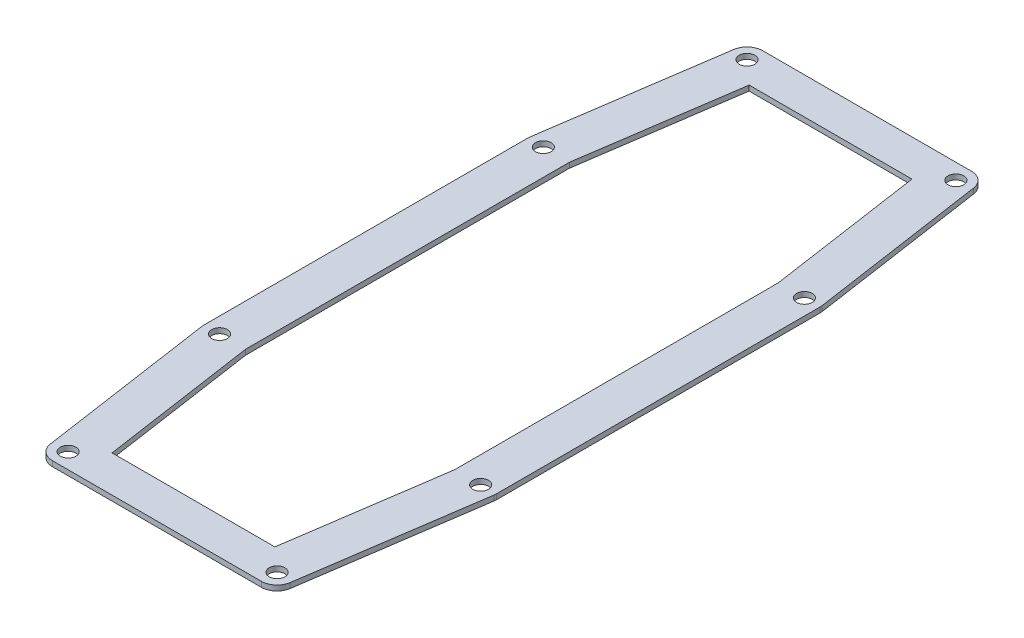
ISO-10303-21;
HEADER;
FILE_DESCRIPTION(('STEP AP214'),'2;1');
FILE_NAME('part.step','',(''),(''),'','','');
FILE_SCHEMA(('AUTOMOTIVE_DESIGN { 1 0 10303 214 1 1 1 1 }'));
ENDSEC;
DATA;
#1=APPLICATION_CONTEXT('core data for automotive mechanical design processes');
#2=APPLICATION_PROTOCOL_DEFINITION('international standard','automotive_design',2000,#1);
#3=PRODUCT_CONTEXT('',#1,'mechanical');
#4=PRODUCT('Part','Part','',(#3));
#5=PRODUCT_RELATED_PRODUCT_CATEGORY('part','',(#4));
#6=PRODUCT_DEFINITION_FORMATION('','',#4);
#7=PRODUCT_DEFINITION_CONTEXT('part definition',#1,'design');
#8=PRODUCT_DEFINITION('design','',#6,#7);
#9=PRODUCT_DEFINITION_SHAPE('','',#8);
#10=(LENGTH_UNIT() NAMED_UNIT(*) SI_UNIT(.MILLI.,.METRE.));
#11=(NAMED_UNIT(*) PLANE_ANGLE_UNIT() SI_UNIT($,.RADIAN.));
#12=(NAMED_UNIT(*) SI_UNIT($,.STERADIAN.) SOLID_ANGLE_UNIT());
#13=UNCERTAINTY_MEASURE_WITH_UNIT(LENGTH_MEASURE(1.E-05),#10,'distance_accuracy_value','');
#14=(GEOMETRIC_REPRESENTATION_CONTEXT(3) GLOBAL_UNCERTAINTY_ASSIGNED_CONTEXT((#13)) GLOBAL_UNIT_ASSIGNED_CONTEXT((#10,
#11,#12)) REPRESENTATION_CONTEXT('',''));
#15=CARTESIAN_POINT('',(0.,0.,0.));
#16=DIRECTION('',(0.,0.,1.));
#17=DIRECTION('',(1.,0.,0.));
#18=AXIS2_PLACEMENT_3D('',#15,#16,#17);
#19=CARTESIAN_POINT('',(45.,1.,34.));
#20=DIRECTION('',(0.,-1.,0.));
#21=DIRECTION('',(0.,0.,-1.));
#22=AXIS2_PLACEMENT_3D('',#19,#20,#21);
#23=PLANE('',#22);
#24=CARTESIAN_POINT('',(45.,1.,34.));
#25=DIRECTION('',(0.,1.,0.));
#26=DIRECTION('',(0.,0.,1.));
#27=AXIS2_PLACEMENT_3D('',#24,#25,#26);
#28=CIRCLE('',#27,1.5);
#29=CARTESIAN_POINT('',(45.,1.,35.5));
#30=VERTEX_POINT('',#29);
#31=EDGE_CURVE('E261',#30,#30,#28,.T.);
#32=ORIENTED_EDGE('',*,*,#31,.F.);
#33=EDGE_LOOP('',(#32));
#34=FACE_BOUND('',#33,.T.);
#35=CARTESIAN_POINT('',(5.00000000000002,1.,34.));
#36=DIRECTION('',(0.,1.,0.));
#37=DIRECTION('',(0.,0.,1.));
#38=AXIS2_PLACEMENT_3D('',#35,#36,#37);
#39=CIRCLE('',#38,1.5);
#40=CARTESIAN_POINT('',(5.00000000000002,1.,35.5));
#41=VERTEX_POINT('',#40);
#42=EDGE_CURVE('E267',#41,#41,#39,.T.);
#43=ORIENTED_EDGE('',*,*,#42,.F.);
#44=EDGE_LOOP('',(#43));
#45=FACE_BOUND('',#44,.T.);
#46=CARTESIAN_POINT('',(45.,1.,-96.));
#47=DIRECTION('',(0.,1.,0.));
#48=DIRECTION('',(0.,0.,1.));
#49=AXIS2_PLACEMENT_3D('',#46,#47,#48);
#50=CIRCLE('',#49,1.5);
#51=CARTESIAN_POINT('',(45.,1.,-94.5));
#52=VERTEX_POINT('',#51);
#53=EDGE_CURVE('E273',#52,#52,#50,.T.);
#54=ORIENTED_EDGE('',*,*,#53,.F.);
#55=EDGE_LOOP('',(#54));
#56=FACE_BOUND('',#55,.T.);
#57=CARTESIAN_POINT('',(5.,1.,-96.));
#58=DIRECTION('',(0.,1.,0.));
#59=DIRECTION('',(0.,0.,1.));
#60=AXIS2_PLACEMENT_3D('',#57,#58,#59);
#61=CIRCLE('',#60,1.5);
#62=CARTESIAN_POINT('',(5.,1.,-94.5));
#63=VERTEX_POINT('',#62);
#64=EDGE_CURVE('E279',#63,#63,#61,.T.);
#65=ORIENTED_EDGE('',*,*,#64,.F.);
#66=EDGE_LOOP('',(#65));
#67=FACE_BOUND('',#66,.T.);
#68=CARTESIAN_POINT('',(50.,1.,0.));
#69=DIRECTION('',(0.,1.,0.));
#70=DIRECTION('',(0.,0.,1.));
#71=AXIS2_PLACEMENT_3D('',#68,#69,#70);
#72=CIRCLE('',#71,1.5);
#73=CARTESIAN_POINT('',(50.,1.,1.5));
#74=VERTEX_POINT('',#73);
#75=EDGE_CURVE('E285',#74,#74,#72,.T.);
#76=ORIENTED_EDGE('',*,*,#75,.F.);
#77=EDGE_LOOP('',(#76));
#78=FACE_BOUND('',#77,.T.);
#79=CARTESIAN_POINT('',(0.,1.,0.));
#80=DIRECTION('',(0.,1.,0.));
#81=DIRECTION('',(0.,0.,1.));
#82=AXIS2_PLACEMENT_3D('',#79,#80,#81);
#83=CIRCLE('',#82,1.5);
#84=CARTESIAN_POINT('',(0.,1.,1.5));
#85=VERTEX_POINT('',#84);
#86=EDGE_CURVE('E291',#85,#85,#83,.T.);
#87=ORIENTED_EDGE('',*,*,#86,.F.);
#88=EDGE_LOOP('',(#87));
#89=FACE_BOUND('',#88,.T.);
#90=CARTESIAN_POINT('',(50.,1.,-62.));
#91=DIRECTION('',(0.,1.,0.));
#92=DIRECTION('',(0.,0.,1.));
#93=AXIS2_PLACEMENT_3D('',#90,#91,#92);
#94=CIRCLE('',#93,1.5);
#95=CARTESIAN_POINT('',(50.,1.,-60.5));
#96=VERTEX_POINT('',#95);
#97=EDGE_CURVE('E297',#96,#96,#94,.T.);
#98=ORIENTED_EDGE('',*,*,#97,.F.);
#99=EDGE_LOOP('',(#98));
#100=FACE_BOUND('',#99,.T.);
#101=CARTESIAN_POINT('',(0.,1.,-62.));
#102=DIRECTION('',(0.,1.,0.));
#103=DIRECTION('',(0.,0.,1.));
#104=AXIS2_PLACEMENT_3D('',#101,#102,#103);
#105=CIRCLE('',#104,1.5);
#106=CARTESIAN_POINT('',(0.,1.,-60.5));
#107=VERTEX_POINT('',#106);
#108=EDGE_CURVE('E303',#107,#107,#105,.T.);
#109=ORIENTED_EDGE('',*,*,#108,.F.);
#110=EDGE_LOOP('',(#109));
#111=FACE_BOUND('',#110,.T.);
#112=CARTESIAN_POINT('',(45.,1.,34.));
#113=DIRECTION('',(0.,1.,0.));
#114=DIRECTION('',(0.,0.,-1.));
#115=AXIS2_PLACEMENT_3D('',#112,#113,#114);
#116=CIRCLE('',#115,2.99999999999999);
#117=CARTESIAN_POINT('',(45.,1.,37.));
#118=VERTEX_POINT('',#117);
#119=CARTESIAN_POINT('',(47.9680774060946,1.,34.4364819714845));
#120=VERTEX_POINT('',#119);
#121=EDGE_CURVE('E309',#118,#120,#116,.T.);
#122=ORIENTED_EDGE('',*,*,#121,.T.);
#123=DIRECTION('',(0.145493990494832,0.,-0.989359135364853));
#124=VECTOR('',#123,1.);
#125=CARTESIAN_POINT('',(52.9680774060946,1.,0.436481971484495));
#126=LINE('',#125,#124);
#127=CARTESIAN_POINT('',(52.9680774060946,1.,0.436481971484495));
#128=VERTEX_POINT('',#127);
#129=EDGE_CURVE('E312',#120,#128,#126,.T.);
#130=ORIENTED_EDGE('',*,*,#129,.T.);
#131=CARTESIAN_POINT('',(50.,1.,0.));
#132=DIRECTION('',(0.,1.,0.));
#133=DIRECTION('',(0.,0.,-1.));
#134=AXIS2_PLACEMENT_3D('',#131,#132,#133);
#135=CIRCLE('',#134,3.);
#136=CARTESIAN_POINT('',(53.,1.,0.));
#137=VERTEX_POINT('',#136);
#138=EDGE_CURVE('E315',#128,#137,#135,.T.);
#139=ORIENTED_EDGE('',*,*,#138,.T.);
#140=DIRECTION('',(0.,0.,-1.));
#141=VECTOR('',#140,1.);
#142=CARTESIAN_POINT('',(53.,1.,-62.));
#143=LINE('',#142,#141);
#144=CARTESIAN_POINT('',(53.,1.,-62.));
#145=VERTEX_POINT('',#144);
#146=EDGE_CURVE('E317',#137,#145,#143,.T.);
#147=ORIENTED_EDGE('',*,*,#146,.T.);
#148=CARTESIAN_POINT('',(50.,1.,-62.));
#149=DIRECTION('',(0.,1.,0.));
#150=DIRECTION('',(0.,0.,-1.));
#151=AXIS2_PLACEMENT_3D('',#148,#149,#150);
#152=CIRCLE('',#151,2.99999999999999);
#153=CARTESIAN_POINT('',(52.9680774060946,1.,-62.4364819714845));
#154=VERTEX_POINT('',#153);
#155=EDGE_CURVE('E319',#145,#154,#152,.T.);
#156=ORIENTED_EDGE('',*,*,#155,.T.);
#157=DIRECTION('',(-0.145493990494831,0.,-0.989359135364853));
#158=VECTOR('',#157,1.);
#159=CARTESIAN_POINT('',(47.9680774060946,1.,-96.4364819714845));
#160=LINE('',#159,#158);
#161=CARTESIAN_POINT('',(47.9680774060946,1.,-96.4364819714845));
#162=VERTEX_POINT('',#161);
#163=EDGE_CURVE('E321',#154,#162,#160,.T.);
#164=ORIENTED_EDGE('',*,*,#163,.T.);
#165=CARTESIAN_POINT('',(45.,1.,-96.));
#166=DIRECTION('',(0.,1.,0.));
#167=DIRECTION('',(0.,0.,-1.));
#168=AXIS2_PLACEMENT_3D('',#165,#166,#167);
#169=CIRCLE('',#168,3.);
#170=CARTESIAN_POINT('',(45.,1.,-99.));
#171=VERTEX_POINT('',#170);
#172=EDGE_CURVE('E323',#162,#171,#169,.T.);
#173=ORIENTED_EDGE('',*,*,#172,.T.);
#174=DIRECTION('',(-1.,0.,0.));
#175=VECTOR('',#174,1.);
#176=CARTESIAN_POINT('',(5.,1.,-99.));
#177=LINE('',#176,#175);
#178=CARTESIAN_POINT('',(5.,1.,-99.));
#179=VERTEX_POINT('',#178);
#180=EDGE_CURVE('E325',#171,#179,#177,.T.);
#181=ORIENTED_EDGE('',*,*,#180,.T.);
#182=CARTESIAN_POINT('',(5.,1.,-96.));
#183=DIRECTION('',(0.,1.,0.));
#184=DIRECTION('',(0.,0.,1.));
#185=AXIS2_PLACEMENT_3D('',#182,#183,#184);
#186=CIRCLE('',#185,3.00000000000001);
#187=CARTESIAN_POINT('',(2.03192259390543,1.,-96.4364819714845));
#188=VERTEX_POINT('',#187);
#189=EDGE_CURVE('E327',#179,#188,#186,.T.);
#190=ORIENTED_EDGE('',*,*,#189,.T.);
#191=DIRECTION('',(-0.145493990494831,0.,0.989359135364853));
#192=VECTOR('',#191,1.);
#193=CARTESIAN_POINT('',(2.03192259390544,1.,-96.4364819714845));
#194=LINE('',#193,#192);
#195=CARTESIAN_POINT('',(-2.96807740609456,1.,-62.4364819714845));
#196=VERTEX_POINT('',#195);
#197=EDGE_CURVE('E329',#188,#196,#194,.T.);
#198=ORIENTED_EDGE('',*,*,#197,.T.);
#199=CARTESIAN_POINT('',(0.,1.,-62.));
#200=DIRECTION('',(0.,1.,0.));
#201=DIRECTION('',(0.,0.,1.));
#202=AXIS2_PLACEMENT_3D('',#199,#200,#201);
#203=CIRCLE('',#202,3.);
#204=CARTESIAN_POINT('',(-3.,1.,-62.));
#205=VERTEX_POINT('',#204);
#206=EDGE_CURVE('E331',#196,#205,#203,.T.);
#207=ORIENTED_EDGE('',*,*,#206,.T.);
#208=DIRECTION('',(0.,0.,1.));
#209=VECTOR('',#208,1.);
#210=CARTESIAN_POINT('',(-3.,1.,-62.));
#211=LINE('',#210,#209);
#212=CARTESIAN_POINT('',(-3.,1.,0.));
#213=VERTEX_POINT('',#212);
#214=EDGE_CURVE('E333',#205,#213,#211,.T.);
#215=ORIENTED_EDGE('',*,*,#214,.T.);
#216=CARTESIAN_POINT('',(0.,1.,0.));
#217=DIRECTION('',(0.,1.,0.));
#218=DIRECTION('',(0.,0.,1.));
#219=AXIS2_PLACEMENT_3D('',#216,#217,#218);
#220=CIRCLE('',#219,3.);
#221=CARTESIAN_POINT('',(-2.96807740609456,1.,0.436481971484493));
#222=VERTEX_POINT('',#221);
#223=EDGE_CURVE('E335',#213,#222,#220,.T.);
#224=ORIENTED_EDGE('',*,*,#223,.T.);
#225=DIRECTION('',(0.145493990494832,0.,0.989359135364853));
#226=VECTOR('',#225,1.);
#227=CARTESIAN_POINT('',(-2.96807740609456,1.,0.436481971484495));
#228=LINE('',#227,#226);
#229=CARTESIAN_POINT('',(2.03192259390546,1.,34.4364819714845));
#230=VERTEX_POINT('',#229);
#231=EDGE_CURVE('E337',#222,#230,#228,.T.);
#232=ORIENTED_EDGE('',*,*,#231,.T.);
#233=CARTESIAN_POINT('',(5.00000000000002,1.,34.));
#234=DIRECTION('',(0.,1.,0.));
#235=DIRECTION('',(0.,0.,1.));
#236=AXIS2_PLACEMENT_3D('',#233,#234,#235);
#237=CIRCLE('',#236,3.);
#238=CARTESIAN_POINT('',(5.00000000000002,1.,37.));
#239=VERTEX_POINT('',#238);
#240=EDGE_CURVE('E339',#230,#239,#237,.T.);
#241=ORIENTED_EDGE('',*,*,#240,.T.);
#242=DIRECTION('',(1.,0.,0.));
#243=VECTOR('',#242,1.);
#244=CARTESIAN_POINT('',(5.00000000000002,1.,37.));
#245=LINE('',#244,#243);
#246=EDGE_CURVE('E341',#239,#118,#245,.T.);
#247=ORIENTED_EDGE('',*,*,#246,.T.);
#248=EDGE_LOOP('',(#122,#130,#139,#147,#156,#164,#173,#181,#190,#198,#207,#215,#224,#232,#241,#247));
#249=FACE_BOUND('',#248,.T.);
#250=DIRECTION('',(-1.,0.,0.));
#251=VECTOR('',#250,1.);
#252=CARTESIAN_POINT('',(9.41176470588236,1.,-92.));
#253=LINE('',#252,#251);
#254=CARTESIAN_POINT('',(40.5882352941176,1.,-92.));
#255=VERTEX_POINT('',#254);
#256=CARTESIAN_POINT('',(9.41176470588236,1.,-92.));
#257=VERTEX_POINT('',#256);
#258=EDGE_CURVE('E196',#255,#257,#253,.T.);
#259=ORIENTED_EDGE('',*,*,#258,.F.);
#260=DIRECTION('',(-0.145493990494832,0.,-0.989359135364853));
#261=VECTOR('',#260,1.);
#262=CARTESIAN_POINT('',(40.5882352941176,1.,-92.));
#263=LINE('',#262,#261);
#264=CARTESIAN_POINT('',(45.,1.,-62.));
#265=VERTEX_POINT('',#264);
#266=EDGE_CURVE('E229',#265,#255,#263,.T.);
#267=ORIENTED_EDGE('',*,*,#266,.F.);
#268=DIRECTION('',(0.,0.,-1.));
#269=VECTOR('',#268,1.);
#270=CARTESIAN_POINT('',(45.,1.,-62.));
#271=LINE('',#270,#269);
#272=CARTESIAN_POINT('',(45.,1.,0.));
#273=VERTEX_POINT('',#272);
#274=EDGE_CURVE('E227',#273,#265,#271,.T.);
#275=ORIENTED_EDGE('',*,*,#274,.F.);
#276=DIRECTION('',(0.145493990494831,0.,-0.989359135364853));
#277=VECTOR('',#276,1.);
#278=CARTESIAN_POINT('',(45.,1.,0.));
#279=LINE('',#278,#277);
#280=CARTESIAN_POINT('',(40.5882352941176,1.,30.));
#281=VERTEX_POINT('',#280);
#282=EDGE_CURVE('E225',#281,#273,#279,.T.);
#283=ORIENTED_EDGE('',*,*,#282,.F.);
#284=DIRECTION('',(1.,0.,0.));
#285=VECTOR('',#284,1.);
#286=CARTESIAN_POINT('',(9.41176470588238,1.,30.));
#287=LINE('',#286,#285);
#288=CARTESIAN_POINT('',(9.41176470588238,1.,30.));
#289=VERTEX_POINT('',#288);
#290=EDGE_CURVE('E223',#289,#281,#287,.T.);
#291=ORIENTED_EDGE('',*,*,#290,.F.);
#292=DIRECTION('',(0.145493990494832,0.,0.989359135364853));
#293=VECTOR('',#292,1.);
#294=CARTESIAN_POINT('',(5.00000000000002,1.,0.));
#295=LINE('',#294,#293);
#296=CARTESIAN_POINT('',(5.00000000000002,1.,0.));
#297=VERTEX_POINT('',#296);
#298=EDGE_CURVE('E219',#297,#289,#295,.T.);
#299=ORIENTED_EDGE('',*,*,#298,.F.);
#300=DIRECTION('',(0.,0.,1.));
#301=VECTOR('',#300,1.);
#302=CARTESIAN_POINT('',(5.,1.,-62.));
#303=LINE('',#302,#301);
#304=CARTESIAN_POINT('',(5.,1.,-62.));
#305=VERTEX_POINT('',#304);
#306=EDGE_CURVE('E217',#305,#297,#303,.T.);
#307=ORIENTED_EDGE('',*,*,#306,.F.);
#308=DIRECTION('',(-0.145493990494831,0.,0.989359135364853));
#309=VECTOR('',#308,1.);
#310=CARTESIAN_POINT('',(9.41176470588236,1.,-92.));
#311=LINE('',#310,#309);
#312=EDGE_CURVE('E204',#257,#305,#311,.T.);
#313=ORIENTED_EDGE('',*,*,#312,.F.);
#314=EDGE_LOOP('',(#259,#267,#275,#283,#291,#299,#307,#313));
#315=FACE_BOUND('',#314,.T.);
#316=ADVANCED_FACE('F35',(#34,#45,#56,#67,#78,#89,#100,#111,#249,#315),#23,.F.);
#317=CARTESIAN_POINT('',(45.,0.,34.));
#318=DIRECTION('',(0.,-1.,0.));
#319=DIRECTION('',(0.,0.,-1.));
#320=AXIS2_PLACEMENT_3D('',#317,#318,#319);
#321=PLANE('',#320);
#322=CARTESIAN_POINT('',(5.00000000000002,0.,34.));
#323=DIRECTION('',(0.,1.,0.));
#324=DIRECTION('',(0.,0.,1.));
#325=AXIS2_PLACEMENT_3D('',#322,#323,#324);
#326=CIRCLE('',#325,1.5);
#327=CARTESIAN_POINT('',(5.00000000000002,0.,35.5));
#328=VERTEX_POINT('',#327);
#329=EDGE_CURVE('E264',#328,#328,#326,.T.);
#330=ORIENTED_EDGE('',*,*,#329,.T.);
#331=EDGE_LOOP('',(#330));
#332=FACE_BOUND('',#331,.T.);
#333=CARTESIAN_POINT('',(5.,0.,-96.));
#334=DIRECTION('',(0.,1.,0.));
#335=DIRECTION('',(0.,0.,1.));
#336=AXIS2_PLACEMENT_3D('',#333,#334,#335);
#337=CIRCLE('',#336,1.5);
#338=CARTESIAN_POINT('',(5.,0.,-94.5));
#339=VERTEX_POINT('',#338);
#340=EDGE_CURVE('E276',#339,#339,#337,.T.);
#341=ORIENTED_EDGE('',*,*,#340,.T.);
#342=EDGE_LOOP('',(#341));
#343=FACE_BOUND('',#342,.T.);
#344=CARTESIAN_POINT('',(0.,0.,0.));
#345=DIRECTION('',(0.,1.,0.));
#346=DIRECTION('',(0.,0.,1.));
#347=AXIS2_PLACEMENT_3D('',#344,#345,#346);
#348=CIRCLE('',#347,1.5);
#349=CARTESIAN_POINT('',(0.,0.,1.5));
#350=VERTEX_POINT('',#349);
#351=EDGE_CURVE('E288',#350,#350,#348,.T.);
#352=ORIENTED_EDGE('',*,*,#351,.T.);
#353=EDGE_LOOP('',(#352));
#354=FACE_BOUND('',#353,.T.);
#355=CARTESIAN_POINT('',(0.,0.,-62.));
#356=DIRECTION('',(0.,1.,0.));
#357=DIRECTION('',(0.,0.,1.));
#358=AXIS2_PLACEMENT_3D('',#355,#356,#357);
#359=CIRCLE('',#358,1.5);
#360=CARTESIAN_POINT('',(0.,0.,-60.5));
#361=VERTEX_POINT('',#360);
#362=EDGE_CURVE('E300',#361,#361,#359,.T.);
#363=ORIENTED_EDGE('',*,*,#362,.T.);
#364=EDGE_LOOP('',(#363));
#365=FACE_BOUND('',#364,.T.);
#366=CARTESIAN_POINT('',(45.,0.,34.));
#367=DIRECTION('',(0.,1.,0.));
#368=DIRECTION('',(0.,0.,-1.));
#369=AXIS2_PLACEMENT_3D('',#366,#367,#368);
#370=CIRCLE('',#369,2.99999999999999);
#371=CARTESIAN_POINT('',(45.,0.,37.));
#372=VERTEX_POINT('',#371);
#373=CARTESIAN_POINT('',(47.9680774060946,0.,34.4364819714845));
#374=VERTEX_POINT('',#373);
#375=EDGE_CURVE('E306',#372,#374,#370,.T.);
#376=ORIENTED_EDGE('',*,*,#375,.F.);
#377=DIRECTION('',(1.,0.,0.));
#378=VECTOR('',#377,1.);
#379=CARTESIAN_POINT('',(5.00000000000002,0.,37.));
#380=LINE('',#379,#378);
#381=CARTESIAN_POINT('',(5.00000000000002,0.,37.));
#382=VERTEX_POINT('',#381);
#383=EDGE_CURVE('E313',#382,#372,#380,.T.);
#384=ORIENTED_EDGE('',*,*,#383,.F.);
#385=CARTESIAN_POINT('',(5.00000000000002,0.,34.));
#386=DIRECTION('',(0.,1.,0.));
#387=DIRECTION('',(0.,0.,1.));
#388=AXIS2_PLACEMENT_3D('',#385,#386,#387);
#389=CIRCLE('',#388,3.);
#390=CARTESIAN_POINT('',(2.03192259390546,0.,34.4364819714845));
#391=VERTEX_POINT('',#390);
#392=EDGE_CURVE('E372',#391,#382,#389,.T.);
#393=ORIENTED_EDGE('',*,*,#392,.F.);
#394=DIRECTION('',(0.145493990494832,0.,0.989359135364853));
#395=VECTOR('',#394,1.);
#396=CARTESIAN_POINT('',(-2.96807740609456,0.,0.436481971484495));
#397=LINE('',#396,#395);
#398=CARTESIAN_POINT('',(-2.96807740609456,0.,0.436481971484493));
#399=VERTEX_POINT('',#398);
#400=EDGE_CURVE('E370',#399,#391,#397,.T.);
#401=ORIENTED_EDGE('',*,*,#400,.F.);
#402=CARTESIAN_POINT('',(0.,0.,0.));
#403=DIRECTION('',(0.,1.,0.));
#404=DIRECTION('',(0.,0.,1.));
#405=AXIS2_PLACEMENT_3D('',#402,#403,#404);
#406=CIRCLE('',#405,3.);
#407=CARTESIAN_POINT('',(-3.,0.,0.));
#408=VERTEX_POINT('',#407);
#409=EDGE_CURVE('E368',#408,#399,#406,.T.);
#410=ORIENTED_EDGE('',*,*,#409,.F.);
#411=DIRECTION('',(0.,0.,1.));
#412=VECTOR('',#411,1.);
#413=CARTESIAN_POINT('',(-3.,0.,-62.));
#414=LINE('',#413,#412);
#415=CARTESIAN_POINT('',(-3.,0.,-62.));
#416=VERTEX_POINT('',#415);
#417=EDGE_CURVE('E366',#416,#408,#414,.T.);
#418=ORIENTED_EDGE('',*,*,#417,.F.);
#419=CARTESIAN_POINT('',(0.,0.,-62.));
#420=DIRECTION('',(0.,1.,0.));
#421=DIRECTION('',(0.,0.,1.));
#422=AXIS2_PLACEMENT_3D('',#419,#420,#421);
#423=CIRCLE('',#422,3.);
#424=CARTESIAN_POINT('',(-2.96807740609456,0.,-62.4364819714845));
#425=VERTEX_POINT('',#424);
#426=EDGE_CURVE('E364',#425,#416,#423,.T.);
#427=ORIENTED_EDGE('',*,*,#426,.F.);
#428=DIRECTION('',(-0.145493990494831,0.,0.989359135364853));
#429=VECTOR('',#428,1.);
#430=CARTESIAN_POINT('',(2.03192259390544,0.,-96.4364819714845));
#431=LINE('',#430,#429);
#432=CARTESIAN_POINT('',(2.03192259390543,0.,-96.4364819714845));
#433=VERTEX_POINT('',#432);
#434=EDGE_CURVE('E362',#433,#425,#431,.T.);
#435=ORIENTED_EDGE('',*,*,#434,.F.);
#436=CARTESIAN_POINT('',(5.,0.,-96.));
#437=DIRECTION('',(0.,1.,0.));
#438=DIRECTION('',(0.,0.,1.));
#439=AXIS2_PLACEMENT_3D('',#436,#437,#438);
#440=CIRCLE('',#439,3.00000000000001);
#441=CARTESIAN_POINT('',(5.,0.,-99.));
#442=VERTEX_POINT('',#441);
#443=EDGE_CURVE('E360',#442,#433,#440,.T.);
#444=ORIENTED_EDGE('',*,*,#443,.F.);
#445=DIRECTION('',(-1.,0.,0.));
#446=VECTOR('',#445,1.);
#447=CARTESIAN_POINT('',(5.,0.,-99.));
#448=LINE('',#447,#446);
#449=CARTESIAN_POINT('',(45.,0.,-99.));
#450=VERTEX_POINT('',#449);
#451=EDGE_CURVE('E358',#450,#442,#448,.T.);
#452=ORIENTED_EDGE('',*,*,#451,.F.);
#453=CARTESIAN_POINT('',(45.,0.,-96.));
#454=DIRECTION('',(0.,1.,0.));
#455=DIRECTION('',(0.,0.,-1.));
#456=AXIS2_PLACEMENT_3D('',#453,#454,#455);
#457=CIRCLE('',#456,3.);
#458=CARTESIAN_POINT('',(47.9680774060946,0.,-96.4364819714845));
#459=VERTEX_POINT('',#458);
#460=EDGE_CURVE('E356',#459,#450,#457,.T.);
#461=ORIENTED_EDGE('',*,*,#460,.F.);
#462=DIRECTION('',(-0.145493990494831,0.,-0.989359135364853));
#463=VECTOR('',#462,1.);
#464=CARTESIAN_POINT('',(47.9680774060946,0.,-96.4364819714845));
#465=LINE('',#464,#463);
#466=CARTESIAN_POINT('',(52.9680774060946,0.,-62.4364819714845));
#467=VERTEX_POINT('',#466);
#468=EDGE_CURVE('E354',#467,#459,#465,.T.);
#469=ORIENTED_EDGE('',*,*,#468,.F.);
#470=CARTESIAN_POINT('',(50.,0.,-62.));
#471=DIRECTION('',(0.,1.,0.));
#472=DIRECTION('',(0.,0.,-1.));
#473=AXIS2_PLACEMENT_3D('',#470,#471,#472);
#474=CIRCLE('',#473,2.99999999999999);
#475=CARTESIAN_POINT('',(53.,0.,-62.));
#476=VERTEX_POINT('',#475);
#477=EDGE_CURVE('E352',#476,#467,#474,.T.);
#478=ORIENTED_EDGE('',*,*,#477,.F.);
#479=DIRECTION('',(0.,0.,-1.));
#480=VECTOR('',#479,1.);
#481=CARTESIAN_POINT('',(53.,0.,-62.));
#482=LINE('',#481,#480);
#483=CARTESIAN_POINT('',(53.,0.,0.));
#484=VERTEX_POINT('',#483);
#485=EDGE_CURVE('E350',#484,#476,#482,.T.);
#486=ORIENTED_EDGE('',*,*,#485,.F.);
#487=CARTESIAN_POINT('',(50.,0.,0.));
#488=DIRECTION('',(0.,1.,0.));
#489=DIRECTION('',(0.,0.,-1.));
#490=AXIS2_PLACEMENT_3D('',#487,#488,#489);
#491=CIRCLE('',#490,3.);
#492=CARTESIAN_POINT('',(52.9680774060946,0.,0.436481971484495));
#493=VERTEX_POINT('',#492);
#494=EDGE_CURVE('E348',#493,#484,#491,.T.);
#495=ORIENTED_EDGE('',*,*,#494,.F.);
#496=DIRECTION('',(0.145493990494832,0.,-0.989359135364853));
#497=VECTOR('',#496,1.);
#498=CARTESIAN_POINT('',(52.9680774060946,0.,0.436481971484495));
#499=LINE('',#498,#497);
#500=EDGE_CURVE('E346',#374,#493,#499,.T.);
#501=ORIENTED_EDGE('',*,*,#500,.F.);
#502=EDGE_LOOP('',(#376,#384,#393,#401,#410,#418,#427,#435,#444,#452,#461,#469,#478,#486,#495,#501));
#503=FACE_BOUND('',#502,.T.);
#504=CARTESIAN_POINT('',(50.,0.,-62.));
#505=DIRECTION('',(0.,1.,0.));
#506=DIRECTION('',(0.,0.,1.));
#507=AXIS2_PLACEMENT_3D('',#504,#505,#506);
#508=CIRCLE('',#507,1.5);
#509=CARTESIAN_POINT('',(50.,0.,-60.5));
#510=VERTEX_POINT('',#509);
#511=EDGE_CURVE('E294',#510,#510,#508,.T.);
#512=ORIENTED_EDGE('',*,*,#511,.T.);
#513=EDGE_LOOP('',(#512));
#514=FACE_BOUND('',#513,.T.);
#515=CARTESIAN_POINT('',(50.,0.,0.));
#516=DIRECTION('',(0.,1.,0.));
#517=DIRECTION('',(0.,0.,1.));
#518=AXIS2_PLACEMENT_3D('',#515,#516,#517);
#519=CIRCLE('',#518,1.5);
#520=CARTESIAN_POINT('',(50.,0.,1.5));
#521=VERTEX_POINT('',#520);
#522=EDGE_CURVE('E282',#521,#521,#519,.T.);
#523=ORIENTED_EDGE('',*,*,#522,.T.);
#524=EDGE_LOOP('',(#523));
#525=FACE_BOUND('',#524,.T.);
#526=CARTESIAN_POINT('',(45.,0.,-96.));
#527=DIRECTION('',(0.,1.,0.));
#528=DIRECTION('',(0.,0.,1.));
#529=AXIS2_PLACEMENT_3D('',#526,#527,#528);
#530=CIRCLE('',#529,1.5);
#531=CARTESIAN_POINT('',(45.,0.,-94.5));
#532=VERTEX_POINT('',#531);
#533=EDGE_CURVE('E270',#532,#532,#530,.T.);
#534=ORIENTED_EDGE('',*,*,#533,.T.);
#535=EDGE_LOOP('',(#534));
#536=FACE_BOUND('',#535,.T.);
#537=CARTESIAN_POINT('',(45.,0.,34.));
#538=DIRECTION('',(0.,1.,0.));
#539=DIRECTION('',(0.,0.,1.));
#540=AXIS2_PLACEMENT_3D('',#537,#538,#539);
#541=CIRCLE('',#540,1.5);
#542=CARTESIAN_POINT('',(45.,0.,35.5));
#543=VERTEX_POINT('',#542);
#544=EDGE_CURVE('E212',#543,#543,#541,.T.);
#545=ORIENTED_EDGE('',*,*,#544,.T.);
#546=EDGE_LOOP('',(#545));
#547=FACE_BOUND('',#546,.T.);
#548=DIRECTION('',(-0.145493990494832,0.,-0.989359135364853));
#549=VECTOR('',#548,1.);
#550=CARTESIAN_POINT('',(40.5882352941176,0.,-92.));
#551=LINE('',#550,#549);
#552=CARTESIAN_POINT('',(45.,0.,-62.));
#553=VERTEX_POINT('',#552);
#554=CARTESIAN_POINT('',(40.5882352941176,0.,-92.));
#555=VERTEX_POINT('',#554);
#556=EDGE_CURVE('E205',#553,#555,#551,.T.);
#557=ORIENTED_EDGE('',*,*,#556,.T.);
#558=DIRECTION('',(-1.,0.,0.));
#559=VECTOR('',#558,1.);
#560=CARTESIAN_POINT('',(9.41176470588236,0.,-92.));
#561=LINE('',#560,#559);
#562=CARTESIAN_POINT('',(9.41176470588236,0.,-92.));
#563=VERTEX_POINT('',#562);
#564=EDGE_CURVE('E58',#555,#563,#561,.T.);
#565=ORIENTED_EDGE('',*,*,#564,.T.);
#566=DIRECTION('',(-0.145493990494831,0.,0.989359135364853));
#567=VECTOR('',#566,1.);
#568=CARTESIAN_POINT('',(9.41176470588236,0.,-92.));
#569=LINE('',#568,#567);
#570=CARTESIAN_POINT('',(5.,0.,-62.));
#571=VERTEX_POINT('',#570);
#572=EDGE_CURVE('E211',#563,#571,#569,.T.);
#573=ORIENTED_EDGE('',*,*,#572,.T.);
#574=DIRECTION('',(0.,0.,1.));
#575=VECTOR('',#574,1.);
#576=CARTESIAN_POINT('',(5.,0.,-62.));
#577=LINE('',#576,#575);
#578=CARTESIAN_POINT('',(5.00000000000002,0.,0.));
#579=VERTEX_POINT('',#578);
#580=EDGE_CURVE('E233',#571,#579,#577,.T.);
#581=ORIENTED_EDGE('',*,*,#580,.T.);
#582=DIRECTION('',(0.145493990494832,0.,0.989359135364853));
#583=VECTOR('',#582,1.);
#584=CARTESIAN_POINT('',(5.00000000000002,0.,0.));
#585=LINE('',#584,#583);
#586=CARTESIAN_POINT('',(9.41176470588238,0.,30.));
#587=VERTEX_POINT('',#586);
#588=EDGE_CURVE('E236',#579,#587,#585,.T.);
#589=ORIENTED_EDGE('',*,*,#588,.T.);
#590=DIRECTION('',(1.,0.,0.));
#591=VECTOR('',#590,1.);
#592=CARTESIAN_POINT('',(9.41176470588238,0.,30.));
#593=LINE('',#592,#591);
#594=CARTESIAN_POINT('',(40.5882352941176,0.,30.));
#595=VERTEX_POINT('',#594);
#596=EDGE_CURVE('E239',#587,#595,#593,.T.);
#597=ORIENTED_EDGE('',*,*,#596,.T.);
#598=DIRECTION('',(0.145493990494831,0.,-0.989359135364853));
#599=VECTOR('',#598,1.);
#600=CARTESIAN_POINT('',(45.,0.,0.));
#601=LINE('',#600,#599);
#602=CARTESIAN_POINT('',(45.,0.,0.));
#603=VERTEX_POINT('',#602);
#604=EDGE_CURVE('E242',#595,#603,#601,.T.);
#605=ORIENTED_EDGE('',*,*,#604,.T.);
#606=DIRECTION('',(0.,0.,-1.));
#607=VECTOR('',#606,1.);
#608=CARTESIAN_POINT('',(45.,0.,-62.));
#609=LINE('',#608,#607);
#610=EDGE_CURVE('E245',#603,#553,#609,.T.);
#611=ORIENTED_EDGE('',*,*,#610,.T.);
#612=EDGE_LOOP('',(#557,#565,#573,#581,#589,#597,#605,#611));
#613=FACE_BOUND('',#612,.T.);
#614=ADVANCED_FACE('F426',(#332,#343,#354,#365,#503,#514,#525,#536,#547,#613),#321,.T.);
#615=CARTESIAN_POINT('',(45.,1.,34.));
#616=DIRECTION('',(0.,-1.,0.));
#617=DIRECTION('',(0.,0.,-1.));
#618=AXIS2_PLACEMENT_3D('',#615,#616,#617);
#619=CYLINDRICAL_SURFACE('',#618,2.99999999999999);
#620=ORIENTED_EDGE('',*,*,#375,.T.);
#621=DIRECTION('',(0.,-1.,0.));
#622=VECTOR('',#621,1.);
#623=CARTESIAN_POINT('',(47.9680774060946,1.,34.4364819714845));
#624=LINE('',#623,#622);
#625=EDGE_CURVE('E11',#120,#374,#624,.T.);
#626=ORIENTED_EDGE('',*,*,#625,.F.);
#627=ORIENTED_EDGE('',*,*,#121,.F.);
#628=DIRECTION('',(0.,-1.,0.));
#629=VECTOR('',#628,1.);
#630=CARTESIAN_POINT('',(45.,1.,37.));
#631=LINE('',#630,#629);
#632=EDGE_CURVE('E343',#118,#372,#631,.T.);
#633=ORIENTED_EDGE('',*,*,#632,.T.);
#634=EDGE_LOOP('',(#620,#626,#627,#633));
#635=FACE_BOUND('',#634,.T.);
#636=ADVANCED_FACE('F37',(#635),#619,.T.);
#637=CARTESIAN_POINT('',(52.9680774060946,1.,0.436481971484495));
#638=DIRECTION('',(-0.989359135364853,0.,-0.145493990494832));
#639=DIRECTION('',(-0.145493990494832,0.,0.989359135364853));
#640=AXIS2_PLACEMENT_3D('',#637,#638,#639);
#641=PLANE('',#640);
#642=ORIENTED_EDGE('',*,*,#500,.T.);
#643=DIRECTION('',(0.,-1.,0.));
#644=VECTOR('',#643,1.);
#645=CARTESIAN_POINT('',(52.9680774060946,1.,0.436481971484495));
#646=LINE('',#645,#644);
#647=EDGE_CURVE('E43',#128,#493,#646,.T.);
#648=ORIENTED_EDGE('',*,*,#647,.F.);
#649=ORIENTED_EDGE('',*,*,#129,.F.);
#650=ORIENTED_EDGE('',*,*,#625,.T.);
#651=EDGE_LOOP('',(#642,#648,#649,#650));
#652=FACE_BOUND('',#651,.T.);
#653=ADVANCED_FACE('F443',(#652),#641,.F.);
#654=CARTESIAN_POINT('',(50.,1.,0.));
#655=DIRECTION('',(0.,-1.,0.));
#656=DIRECTION('',(0.,0.,-1.));
#657=AXIS2_PLACEMENT_3D('',#654,#655,#656);
#658=CYLINDRICAL_SURFACE('',#657,3.);
#659=ORIENTED_EDGE('',*,*,#494,.T.);
#660=DIRECTION('',(0.,-1.,0.));
#661=VECTOR('',#660,1.);
#662=CARTESIAN_POINT('',(53.,1.,0.));
#663=LINE('',#662,#661);
#664=EDGE_CURVE('E413',#137,#484,#663,.T.);
#665=ORIENTED_EDGE('',*,*,#664,.F.);
#666=ORIENTED_EDGE('',*,*,#138,.F.);
#667=ORIENTED_EDGE('',*,*,#647,.T.);
#668=EDGE_LOOP('',(#659,#665,#666,#667));
#669=FACE_BOUND('',#668,.T.);
#670=ADVANCED_FACE('F420',(#669),#658,.T.);
#671=CARTESIAN_POINT('',(53.,1.,-62.));
#672=DIRECTION('',(-1.,0.,0.));
#673=DIRECTION('',(0.,0.,1.));
#674=AXIS2_PLACEMENT_3D('',#671,#672,#673);
#675=PLANE('',#674);
#676=ORIENTED_EDGE('',*,*,#485,.T.);
#677=DIRECTION('',(0.,-1.,0.));
#678=VECTOR('',#677,1.);
#679=CARTESIAN_POINT('',(53.,1.,-62.));
#680=LINE('',#679,#678);
#681=EDGE_CURVE('E410',#145,#476,#680,.T.);
#682=ORIENTED_EDGE('',*,*,#681,.F.);
#683=ORIENTED_EDGE('',*,*,#146,.F.);
#684=ORIENTED_EDGE('',*,*,#664,.T.);
#685=EDGE_LOOP('',(#676,#682,#683,#684));
#686=FACE_BOUND('',#685,.T.);
#687=ADVANCED_FACE('F432',(#686),#675,.F.);
#688=CARTESIAN_POINT('',(50.,1.,-62.));
#689=DIRECTION('',(0.,-1.,0.));
#690=DIRECTION('',(0.,0.,-1.));
#691=AXIS2_PLACEMENT_3D('',#688,#689,#690);
#692=CYLINDRICAL_SURFACE('',#691,2.99999999999999);
#693=ORIENTED_EDGE('',*,*,#477,.T.);
#694=DIRECTION('',(0.,-1.,0.));
#695=VECTOR('',#694,1.);
#696=CARTESIAN_POINT('',(52.9680774060946,1.,-62.4364819714845));
#697=LINE('',#696,#695);
#698=EDGE_CURVE('E407',#154,#467,#697,.T.);
#699=ORIENTED_EDGE('',*,*,#698,.F.);
#700=ORIENTED_EDGE('',*,*,#155,.F.);
#701=ORIENTED_EDGE('',*,*,#681,.T.);
#702=EDGE_LOOP('',(#693,#699,#700,#701));
#703=FACE_BOUND('',#702,.T.);
#704=ADVANCED_FACE('F436',(#703),#692,.T.);
#705=CARTESIAN_POINT('',(47.9680774060946,1.,-96.4364819714845));
#706=DIRECTION('',(-0.989359135364853,0.,0.145493990494831));
#707=DIRECTION('',(0.145493990494831,0.,0.989359135364853));
#708=AXIS2_PLACEMENT_3D('',#705,#706,#707);
#709=PLANE('',#708);
#710=ORIENTED_EDGE('',*,*,#468,.T.);
#711=DIRECTION('',(0.,-1.,0.));
#712=VECTOR('',#711,1.);
#713=CARTESIAN_POINT('',(47.9680774060946,1.,-96.4364819714845));
#714=LINE('',#713,#712);
#715=EDGE_CURVE('E404',#162,#459,#714,.T.);
#716=ORIENTED_EDGE('',*,*,#715,.F.);
#717=ORIENTED_EDGE('',*,*,#163,.F.);
#718=ORIENTED_EDGE('',*,*,#698,.T.);
#719=EDGE_LOOP('',(#710,#716,#717,#718));
#720=FACE_BOUND('',#719,.T.);
#721=ADVANCED_FACE('F496',(#720),#709,.F.);
#722=CARTESIAN_POINT('',(45.,1.,-96.));
#723=DIRECTION('',(0.,-1.,0.));
#724=DIRECTION('',(0.,0.,-1.));
#725=AXIS2_PLACEMENT_3D('',#722,#723,#724);
#726=CYLINDRICAL_SURFACE('',#725,3.);
#727=ORIENTED_EDGE('',*,*,#460,.T.);
#728=DIRECTION('',(0.,-1.,0.));
#729=VECTOR('',#728,1.);
#730=CARTESIAN_POINT('',(45.,1.,-99.));
#731=LINE('',#730,#729);
#732=EDGE_CURVE('E401',#171,#450,#731,.T.);
#733=ORIENTED_EDGE('',*,*,#732,.F.);
#734=ORIENTED_EDGE('',*,*,#172,.F.);
#735=ORIENTED_EDGE('',*,*,#715,.T.);
#736=EDGE_LOOP('',(#727,#733,#734,#735));
#737=FACE_BOUND('',#736,.T.);
#738=ADVANCED_FACE('F493',(#737),#726,.T.);
#739=CARTESIAN_POINT('',(5.,1.,-99.));
#740=DIRECTION('',(0.,0.,1.));
#741=DIRECTION('',(1.,0.,0.));
#742=AXIS2_PLACEMENT_3D('',#739,#740,#741);
#743=PLANE('',#742);
#744=ORIENTED_EDGE('',*,*,#451,.T.);
#745=DIRECTION('',(0.,-1.,0.));
#746=VECTOR('',#745,1.);
#747=CARTESIAN_POINT('',(5.,1.,-99.));
#748=LINE('',#747,#746);
#749=EDGE_CURVE('E398',#179,#442,#748,.T.);
#750=ORIENTED_EDGE('',*,*,#749,.F.);
#751=ORIENTED_EDGE('',*,*,#180,.F.);
#752=ORIENTED_EDGE('',*,*,#732,.T.);
#753=EDGE_LOOP('',(#744,#750,#751,#752));
#754=FACE_BOUND('',#753,.T.);
#755=ADVANCED_FACE('F489',(#754),#743,.F.);
#756=CARTESIAN_POINT('',(5.,1.,-96.));
#757=DIRECTION('',(0.,-1.,0.));
#758=DIRECTION('',(0.,0.,-1.));
#759=AXIS2_PLACEMENT_3D('',#756,#757,#758);
#760=CYLINDRICAL_SURFACE('',#759,3.00000000000001);
#761=ORIENTED_EDGE('',*,*,#443,.T.);
#762=DIRECTION('',(0.,-1.,0.));
#763=VECTOR('',#762,1.);
#764=CARTESIAN_POINT('',(2.03192259390543,1.,-96.4364819714845));
#765=LINE('',#764,#763);
#766=EDGE_CURVE('E395',#188,#433,#765,.T.);
#767=ORIENTED_EDGE('',*,*,#766,.F.);
#768=ORIENTED_EDGE('',*,*,#189,.F.);
#769=ORIENTED_EDGE('',*,*,#749,.T.);
#770=EDGE_LOOP('',(#761,#767,#768,#769));
#771=FACE_BOUND('',#770,.T.);
#772=ADVANCED_FACE('F485',(#771),#760,.T.);
#773=CARTESIAN_POINT('',(2.03192259390544,1.,-96.4364819714845));
#774=DIRECTION('',(0.989359135364853,0.,0.145493990494831));
#775=DIRECTION('',(0.145493990494831,0.,-0.989359135364853));
#776=AXIS2_PLACEMENT_3D('',#773,#774,#775);
#777=PLANE('',#776);
#778=ORIENTED_EDGE('',*,*,#434,.T.);
#779=DIRECTION('',(0.,-1.,0.));
#780=VECTOR('',#779,1.);
#781=CARTESIAN_POINT('',(-2.96807740609456,1.,-62.4364819714845));
#782=LINE('',#781,#780);
#783=EDGE_CURVE('E392',#196,#425,#782,.T.);
#784=ORIENTED_EDGE('',*,*,#783,.F.);
#785=ORIENTED_EDGE('',*,*,#197,.F.);
#786=ORIENTED_EDGE('',*,*,#766,.T.);
#787=EDGE_LOOP('',(#778,#784,#785,#786));
#788=FACE_BOUND('',#787,.T.);
#789=ADVANCED_FACE('F480',(#788),#777,.F.);
#790=CARTESIAN_POINT('',(0.,1.,-62.));
#791=DIRECTION('',(0.,-1.,0.));
#792=DIRECTION('',(0.,0.,-1.));
#793=AXIS2_PLACEMENT_3D('',#790,#791,#792);
#794=CYLINDRICAL_SURFACE('',#793,3.);
#795=ORIENTED_EDGE('',*,*,#426,.T.);
#796=DIRECTION('',(0.,-1.,0.));
#797=VECTOR('',#796,1.);
#798=CARTESIAN_POINT('',(-3.,1.,-62.));
#799=LINE('',#798,#797);
#800=EDGE_CURVE('E389',#205,#416,#799,.T.);
#801=ORIENTED_EDGE('',*,*,#800,.F.);
#802=ORIENTED_EDGE('',*,*,#206,.F.);
#803=ORIENTED_EDGE('',*,*,#783,.T.);
#804=EDGE_LOOP('',(#795,#801,#802,#803));
#805=FACE_BOUND('',#804,.T.);
#806=ADVANCED_FACE('F474',(#805),#794,.T.);
#807=CARTESIAN_POINT('',(-3.,1.,-62.));
#808=DIRECTION('',(1.,0.,0.));
#809=DIRECTION('',(0.,0.,-1.));
#810=AXIS2_PLACEMENT_3D('',#807,#808,#809);
#811=PLANE('',#810);
#812=ORIENTED_EDGE('',*,*,#417,.T.);
#813=DIRECTION('',(0.,-1.,0.));
#814=VECTOR('',#813,1.);
#815=CARTESIAN_POINT('',(-3.,1.,0.));
#816=LINE('',#815,#814);
#817=EDGE_CURVE('E386',#213,#408,#816,.T.);
#818=ORIENTED_EDGE('',*,*,#817,.F.);
#819=ORIENTED_EDGE('',*,*,#214,.F.);
#820=ORIENTED_EDGE('',*,*,#800,.T.);
#821=EDGE_LOOP('',(#812,#818,#819,#820));
#822=FACE_BOUND('',#821,.T.);
#823=ADVANCED_FACE('F470',(#822),#811,.F.);
#824=CARTESIAN_POINT('',(0.,1.,0.));
#825=DIRECTION('',(0.,-1.,0.));
#826=DIRECTION('',(0.,0.,-1.));
#827=AXIS2_PLACEMENT_3D('',#824,#825,#826);
#828=CYLINDRICAL_SURFACE('',#827,3.);
#829=ORIENTED_EDGE('',*,*,#409,.T.);
#830=DIRECTION('',(0.,-1.,0.));
#831=VECTOR('',#830,1.);
#832=CARTESIAN_POINT('',(-2.96807740609456,1.,0.436481971484493));
#833=LINE('',#832,#831);
#834=EDGE_CURVE('E383',#222,#399,#833,.T.);
#835=ORIENTED_EDGE('',*,*,#834,.F.);
#836=ORIENTED_EDGE('',*,*,#223,.F.);
#837=ORIENTED_EDGE('',*,*,#817,.T.);
#838=EDGE_LOOP('',(#829,#835,#836,#837));
#839=FACE_BOUND('',#838,.T.);
#840=ADVANCED_FACE('F465',(#839),#828,.T.);
#841=CARTESIAN_POINT('',(-2.96807740609456,1.,0.436481971484495));
#842=DIRECTION('',(0.989359135364853,0.,-0.145493990494832));
#843=DIRECTION('',(-0.145493990494832,0.,-0.989359135364853));
#844=AXIS2_PLACEMENT_3D('',#841,#842,#843);
#845=PLANE('',#844);
#846=ORIENTED_EDGE('',*,*,#400,.T.);
#847=DIRECTION('',(0.,-1.,0.));
#848=VECTOR('',#847,1.);
#849=CARTESIAN_POINT('',(2.03192259390546,1.,34.4364819714845));
#850=LINE('',#849,#848);
#851=EDGE_CURVE('E380',#230,#391,#850,.T.);
#852=ORIENTED_EDGE('',*,*,#851,.F.);
#853=ORIENTED_EDGE('',*,*,#231,.F.);
#854=ORIENTED_EDGE('',*,*,#834,.T.);
#855=EDGE_LOOP('',(#846,#852,#853,#854));
#856=FACE_BOUND('',#855,.T.);
#857=ADVANCED_FACE('F459',(#856),#845,.F.);
#858=CARTESIAN_POINT('',(5.00000000000002,1.,34.));
#859=DIRECTION('',(0.,-1.,0.));
#860=DIRECTION('',(0.,0.,-1.));
#861=AXIS2_PLACEMENT_3D('',#858,#859,#860);
#862=CYLINDRICAL_SURFACE('',#861,3.);
#863=ORIENTED_EDGE('',*,*,#392,.T.);
#864=DIRECTION('',(0.,-1.,0.));
#865=VECTOR('',#864,1.);
#866=CARTESIAN_POINT('',(5.00000000000002,1.,37.));
#867=LINE('',#866,#865);
#868=EDGE_CURVE('E377',#239,#382,#867,.T.);
#869=ORIENTED_EDGE('',*,*,#868,.F.);
#870=ORIENTED_EDGE('',*,*,#240,.F.);
#871=ORIENTED_EDGE('',*,*,#851,.T.);
#872=EDGE_LOOP('',(#863,#869,#870,#871));
#873=FACE_BOUND('',#872,.T.);
#874=ADVANCED_FACE('F455',(#873),#862,.T.);
#875=CARTESIAN_POINT('',(5.00000000000002,1.,37.));
#876=DIRECTION('',(0.,0.,-1.));
#877=DIRECTION('',(-1.,0.,0.));
#878=AXIS2_PLACEMENT_3D('',#875,#876,#877);
#879=PLANE('',#878);
#880=ORIENTED_EDGE('',*,*,#383,.T.);
#881=ORIENTED_EDGE('',*,*,#632,.F.);
#882=ORIENTED_EDGE('',*,*,#246,.F.);
#883=ORIENTED_EDGE('',*,*,#868,.T.);
#884=EDGE_LOOP('',(#880,#881,#882,#883));
#885=FACE_BOUND('',#884,.T.);
#886=ADVANCED_FACE('F450',(#885),#879,.F.);
#887=CARTESIAN_POINT('',(0.,1.,-62.));
#888=DIRECTION('',(0.,-1.,0.));
#889=DIRECTION('',(0.,0.,-1.));
#890=AXIS2_PLACEMENT_3D('',#887,#888,#889);
#891=CYLINDRICAL_SURFACE('',#890,1.5);
#892=ORIENTED_EDGE('',*,*,#108,.T.);
#893=EDGE_LOOP('',(#892));
#894=FACE_BOUND('',#893,.T.);
#895=ORIENTED_EDGE('',*,*,#362,.F.);
#896=EDGE_LOOP('',(#895));
#897=FACE_BOUND('',#896,.T.);
#898=ADVANCED_FACE('F516',(#894,#897),#891,.F.);
#899=CARTESIAN_POINT('',(50.,1.,-62.));
#900=DIRECTION('',(0.,-1.,0.));
#901=DIRECTION('',(0.,0.,-1.));
#902=AXIS2_PLACEMENT_3D('',#899,#900,#901);
#903=CYLINDRICAL_SURFACE('',#902,1.5);
#904=ORIENTED_EDGE('',*,*,#97,.T.);
#905=EDGE_LOOP('',(#904));
#906=FACE_BOUND('',#905,.T.);
#907=ORIENTED_EDGE('',*,*,#511,.F.);
#908=EDGE_LOOP('',(#907));
#909=FACE_BOUND('',#908,.T.);
#910=ADVANCED_FACE('F578',(#906,#909),#903,.F.);
#911=CARTESIAN_POINT('',(0.,1.,0.));
#912=DIRECTION('',(0.,-1.,0.));
#913=DIRECTION('',(0.,0.,-1.));
#914=AXIS2_PLACEMENT_3D('',#911,#912,#913);
#915=CYLINDRICAL_SURFACE('',#914,1.5);
#916=ORIENTED_EDGE('',*,*,#86,.T.);
#917=EDGE_LOOP('',(#916));
#918=FACE_BOUND('',#917,.T.);
#919=ORIENTED_EDGE('',*,*,#351,.F.);
#920=EDGE_LOOP('',(#919));
#921=FACE_BOUND('',#920,.T.);
#922=ADVANCED_FACE('F585',(#918,#921),#915,.F.);
#923=CARTESIAN_POINT('',(50.,1.,0.));
#924=DIRECTION('',(0.,-1.,0.));
#925=DIRECTION('',(0.,0.,-1.));
#926=AXIS2_PLACEMENT_3D('',#923,#924,#925);
#927=CYLINDRICAL_SURFACE('',#926,1.5);
#928=ORIENTED_EDGE('',*,*,#75,.T.);
#929=EDGE_LOOP('',(#928));
#930=FACE_BOUND('',#929,.T.);
#931=ORIENTED_EDGE('',*,*,#522,.F.);
#932=EDGE_LOOP('',(#931));
#933=FACE_BOUND('',#932,.T.);
#934=ADVANCED_FACE('F592',(#930,#933),#927,.F.);
#935=CARTESIAN_POINT('',(5.,1.,-96.));
#936=DIRECTION('',(0.,-1.,0.));
#937=DIRECTION('',(0.,0.,-1.));
#938=AXIS2_PLACEMENT_3D('',#935,#936,#937);
#939=CYLINDRICAL_SURFACE('',#938,1.5);
#940=ORIENTED_EDGE('',*,*,#64,.T.);
#941=EDGE_LOOP('',(#940));
#942=FACE_BOUND('',#941,.T.);
#943=ORIENTED_EDGE('',*,*,#340,.F.);
#944=EDGE_LOOP('',(#943));
#945=FACE_BOUND('',#944,.T.);
#946=ADVANCED_FACE('F600',(#942,#945),#939,.F.);
#947=CARTESIAN_POINT('',(45.,1.,-96.));
#948=DIRECTION('',(0.,-1.,0.));
#949=DIRECTION('',(0.,0.,-1.));
#950=AXIS2_PLACEMENT_3D('',#947,#948,#949);
#951=CYLINDRICAL_SURFACE('',#950,1.5);
#952=ORIENTED_EDGE('',*,*,#53,.T.);
#953=EDGE_LOOP('',(#952));
#954=FACE_BOUND('',#953,.T.);
#955=ORIENTED_EDGE('',*,*,#533,.F.);
#956=EDGE_LOOP('',(#955));
#957=FACE_BOUND('',#956,.T.);
#958=ADVANCED_FACE('F608',(#954,#957),#951,.F.);
#959=CARTESIAN_POINT('',(5.00000000000002,1.,34.));
#960=DIRECTION('',(0.,-1.,0.));
#961=DIRECTION('',(0.,0.,-1.));
#962=AXIS2_PLACEMENT_3D('',#959,#960,#961);
#963=CYLINDRICAL_SURFACE('',#962,1.5);
#964=ORIENTED_EDGE('',*,*,#42,.T.);
#965=EDGE_LOOP('',(#964));
#966=FACE_BOUND('',#965,.T.);
#967=ORIENTED_EDGE('',*,*,#329,.F.);
#968=EDGE_LOOP('',(#967));
#969=FACE_BOUND('',#968,.T.);
#970=ADVANCED_FACE('F616',(#966,#969),#963,.F.);
#971=CARTESIAN_POINT('',(45.,1.,34.));
#972=DIRECTION('',(0.,-1.,0.));
#973=DIRECTION('',(0.,0.,-1.));
#974=AXIS2_PLACEMENT_3D('',#971,#972,#973);
#975=CYLINDRICAL_SURFACE('',#974,1.5);
#976=ORIENTED_EDGE('',*,*,#31,.T.);
#977=EDGE_LOOP('',(#976));
#978=FACE_BOUND('',#977,.T.);
#979=ORIENTED_EDGE('',*,*,#544,.F.);
#980=EDGE_LOOP('',(#979));
#981=FACE_BOUND('',#980,.T.);
#982=ADVANCED_FACE('F624',(#978,#981),#975,.F.);
#983=CARTESIAN_POINT('',(9.41176470588236,1.,-92.));
#984=DIRECTION('',(0.,0.,1.));
#985=DIRECTION('',(1.,0.,0.));
#986=AXIS2_PLACEMENT_3D('',#983,#984,#985);
#987=PLANE('',#986);
#988=ORIENTED_EDGE('',*,*,#564,.F.);
#989=DIRECTION('',(0.,-1.,0.));
#990=VECTOR('',#989,1.);
#991=CARTESIAN_POINT('',(40.5882352941176,1.,-92.));
#992=LINE('',#991,#990);
#993=EDGE_CURVE('E200',#255,#555,#992,.T.);
#994=ORIENTED_EDGE('',*,*,#993,.F.);
#995=ORIENTED_EDGE('',*,*,#258,.T.);
#996=DIRECTION('',(0.,-1.,0.));
#997=VECTOR('',#996,1.);
#998=CARTESIAN_POINT('',(9.41176470588236,1.,-92.));
#999=LINE('',#998,#997);
#1000=EDGE_CURVE('E199',#257,#563,#999,.T.);
#1001=ORIENTED_EDGE('',*,*,#1000,.T.);
#1002=EDGE_LOOP('',(#988,#994,#995,#1001));
#1003=FACE_BOUND('',#1002,.T.);
#1004=ADVANCED_FACE('F198',(#1003),#987,.T.);
#1005=CARTESIAN_POINT('',(9.41176470588236,1.,-92.));
#1006=DIRECTION('',(0.989359135364853,0.,0.145493990494831));
#1007=DIRECTION('',(0.145493990494831,0.,-0.989359135364853));
#1008=AXIS2_PLACEMENT_3D('',#1005,#1006,#1007);
#1009=PLANE('',#1008);
#1010=ORIENTED_EDGE('',*,*,#572,.F.);
#1011=ORIENTED_EDGE('',*,*,#1000,.F.);
#1012=ORIENTED_EDGE('',*,*,#312,.T.);
#1013=DIRECTION('',(0.,-1.,0.));
#1014=VECTOR('',#1013,1.);
#1015=CARTESIAN_POINT('',(5.,1.,-62.));
#1016=LINE('',#1015,#1014);
#1017=EDGE_CURVE('E213',#305,#571,#1016,.T.);
#1018=ORIENTED_EDGE('',*,*,#1017,.T.);
#1019=EDGE_LOOP('',(#1010,#1011,#1012,#1018));
#1020=FACE_BOUND('',#1019,.T.);
#1021=ADVANCED_FACE('F208',(#1020),#1009,.T.);
#1022=CARTESIAN_POINT('',(5.,1.,-62.));
#1023=DIRECTION('',(1.,0.,0.));
#1024=DIRECTION('',(0.,0.,-1.));
#1025=AXIS2_PLACEMENT_3D('',#1022,#1023,#1024);
#1026=PLANE('',#1025);
#1027=ORIENTED_EDGE('',*,*,#580,.F.);
#1028=ORIENTED_EDGE('',*,*,#1017,.F.);
#1029=ORIENTED_EDGE('',*,*,#306,.T.);
#1030=DIRECTION('',(0.,-1.,0.));
#1031=VECTOR('',#1030,1.);
#1032=CARTESIAN_POINT('',(5.00000000000002,1.,0.));
#1033=LINE('',#1032,#1031);
#1034=EDGE_CURVE('E258',#297,#579,#1033,.T.);
#1035=ORIENTED_EDGE('',*,*,#1034,.T.);
#1036=EDGE_LOOP('',(#1027,#1028,#1029,#1035));
#1037=FACE_BOUND('',#1036,.T.);
#1038=ADVANCED_FACE('F645',(#1037),#1026,.T.);
#1039=CARTESIAN_POINT('',(5.00000000000002,1.,0.));
#1040=DIRECTION('',(0.989359135364853,0.,-0.145493990494832));
#1041=DIRECTION('',(-0.145493990494832,0.,-0.989359135364853));
#1042=AXIS2_PLACEMENT_3D('',#1039,#1040,#1041);
#1043=PLANE('',#1042);
#1044=ORIENTED_EDGE('',*,*,#588,.F.);
#1045=ORIENTED_EDGE('',*,*,#1034,.F.);
#1046=ORIENTED_EDGE('',*,*,#298,.T.);
#1047=DIRECTION('',(0.,-1.,0.));
#1048=VECTOR('',#1047,1.);
#1049=CARTESIAN_POINT('',(9.41176470588238,1.,30.));
#1050=LINE('',#1049,#1048);
#1051=EDGE_CURVE('E256',#289,#587,#1050,.T.);
#1052=ORIENTED_EDGE('',*,*,#1051,.T.);
#1053=EDGE_LOOP('',(#1044,#1045,#1046,#1052));
#1054=FACE_BOUND('',#1053,.T.);
#1055=ADVANCED_FACE('F652',(#1054),#1043,.T.);
#1056=CARTESIAN_POINT('',(9.41176470588238,1.,30.));
#1057=DIRECTION('',(0.,0.,-1.));
#1058=DIRECTION('',(-1.,0.,0.));
#1059=AXIS2_PLACEMENT_3D('',#1056,#1057,#1058);
#1060=PLANE('',#1059);
#1061=ORIENTED_EDGE('',*,*,#596,.F.);
#1062=ORIENTED_EDGE('',*,*,#1051,.F.);
#1063=ORIENTED_EDGE('',*,*,#290,.T.);
#1064=DIRECTION('',(0.,-1.,0.));
#1065=VECTOR('',#1064,1.);
#1066=CARTESIAN_POINT('',(40.5882352941176,1.,30.));
#1067=LINE('',#1066,#1065);
#1068=EDGE_CURVE('E254',#281,#595,#1067,.T.);
#1069=ORIENTED_EDGE('',*,*,#1068,.T.);
#1070=EDGE_LOOP('',(#1061,#1062,#1063,#1069));
#1071=FACE_BOUND('',#1070,.T.);
#1072=ADVANCED_FACE('F660',(#1071),#1060,.T.);
#1073=CARTESIAN_POINT('',(45.,1.,0.));
#1074=DIRECTION('',(-0.989359135364853,0.,-0.145493990494831));
#1075=DIRECTION('',(-0.145493990494831,0.,0.989359135364853));
#1076=AXIS2_PLACEMENT_3D('',#1073,#1074,#1075);
#1077=PLANE('',#1076);
#1078=ORIENTED_EDGE('',*,*,#604,.F.);
#1079=ORIENTED_EDGE('',*,*,#1068,.F.);
#1080=ORIENTED_EDGE('',*,*,#282,.T.);
#1081=DIRECTION('',(0.,-1.,0.));
#1082=VECTOR('',#1081,1.);
#1083=CARTESIAN_POINT('',(45.,1.,0.));
#1084=LINE('',#1083,#1082);
#1085=EDGE_CURVE('E252',#273,#603,#1084,.T.);
#1086=ORIENTED_EDGE('',*,*,#1085,.T.);
#1087=EDGE_LOOP('',(#1078,#1079,#1080,#1086));
#1088=FACE_BOUND('',#1087,.T.);
#1089=ADVANCED_FACE('F668',(#1088),#1077,.T.);
#1090=CARTESIAN_POINT('',(45.,1.,-62.));
#1091=DIRECTION('',(-1.,0.,0.));
#1092=DIRECTION('',(0.,0.,1.));
#1093=AXIS2_PLACEMENT_3D('',#1090,#1091,#1092);
#1094=PLANE('',#1093);
#1095=ORIENTED_EDGE('',*,*,#610,.F.);
#1096=ORIENTED_EDGE('',*,*,#1085,.F.);
#1097=ORIENTED_EDGE('',*,*,#274,.T.);
#1098=DIRECTION('',(0.,-1.,0.));
#1099=VECTOR('',#1098,1.);
#1100=CARTESIAN_POINT('',(45.,1.,-62.));
#1101=LINE('',#1100,#1099);
#1102=EDGE_CURVE('E50',#265,#553,#1101,.T.);
#1103=ORIENTED_EDGE('',*,*,#1102,.T.);
#1104=EDGE_LOOP('',(#1095,#1096,#1097,#1103));
#1105=FACE_BOUND('',#1104,.T.);
#1106=ADVANCED_FACE('F676',(#1105),#1094,.T.);
#1107=CARTESIAN_POINT('',(40.5882352941176,1.,-92.));
#1108=DIRECTION('',(-0.989359135364853,0.,0.145493990494832));
#1109=DIRECTION('',(0.145493990494832,0.,0.989359135364853));
#1110=AXIS2_PLACEMENT_3D('',#1107,#1108,#1109);
#1111=PLANE('',#1110);
#1112=ORIENTED_EDGE('',*,*,#556,.F.);
#1113=ORIENTED_EDGE('',*,*,#1102,.F.);
#1114=ORIENTED_EDGE('',*,*,#266,.T.);
#1115=ORIENTED_EDGE('',*,*,#993,.T.);
#1116=EDGE_LOOP('',(#1112,#1113,#1114,#1115));
#1117=FACE_BOUND('',#1116,.T.);
#1118=ADVANCED_FACE('F684',(#1117),#1111,.T.);
#1119=CLOSED_SHELL('',(#316,#614,#636,#653,#670,#687,#704,#721,#738,#755,#772,#789,#806,#823,
#840,#857,#874,#886,#898,#910,#922,#934,#946,#958,#970,#982,#1004,#1021,#1038,#1055,#1072,#1089,
#1106,#1118));
#1120=MANIFOLD_SOLID_BREP('B2',#1119);
#1121=ADVANCED_BREP_SHAPE_REPRESENTATION('',(#18,#1120),#14);
#1122=SHAPE_DEFINITION_REPRESENTATION(#9,#1121);
ENDSEC;
END-ISO-10303-21;
